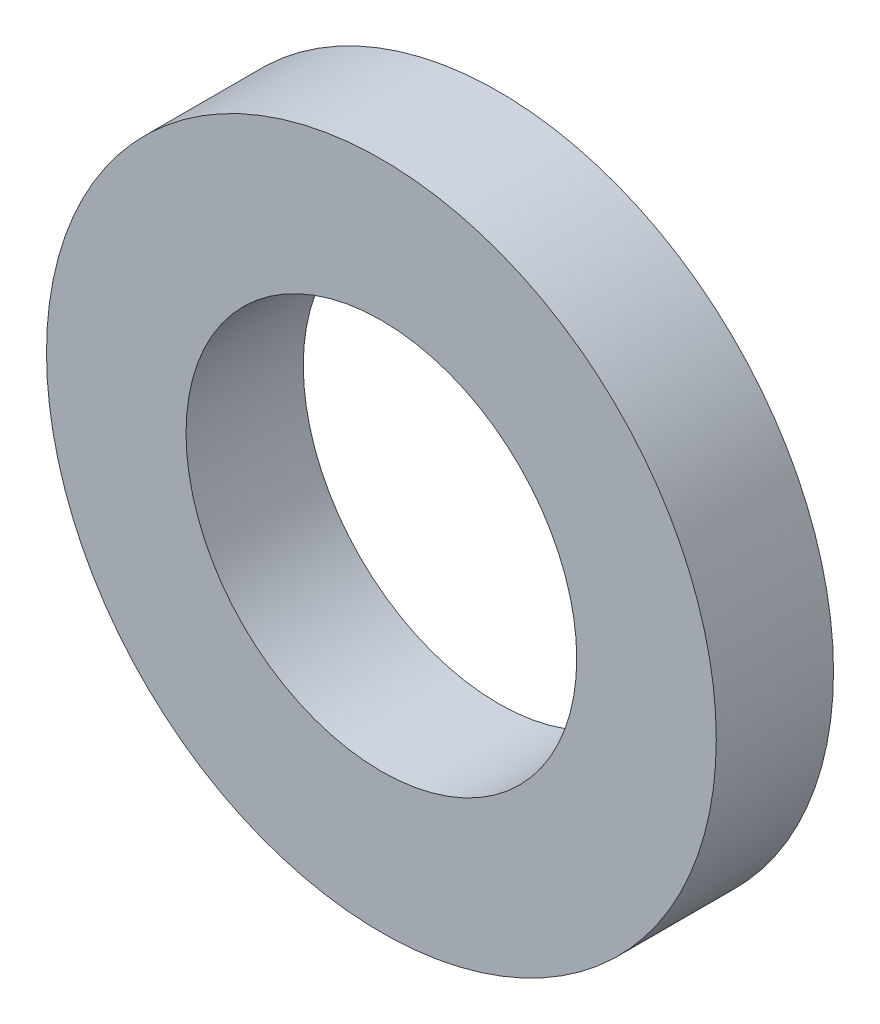
ISO-10303-21;
HEADER;
FILE_DESCRIPTION(('STEP AP214'),'2;1');
FILE_NAME('part.step','',(''),(''),'','','');
FILE_SCHEMA(('AUTOMOTIVE_DESIGN { 1 0 10303 214 1 1 1 1 }'));
ENDSEC;
DATA;
#1=APPLICATION_CONTEXT('core data for automotive mechanical design processes');
#2=APPLICATION_PROTOCOL_DEFINITION('international standard','automotive_design',2000,#1);
#3=PRODUCT_CONTEXT('',#1,'mechanical');
#4=PRODUCT('Part','Part','',(#3));
#5=PRODUCT_RELATED_PRODUCT_CATEGORY('part','',(#4));
#6=PRODUCT_DEFINITION_FORMATION('','',#4);
#7=PRODUCT_DEFINITION_CONTEXT('part definition',#1,'design');
#8=PRODUCT_DEFINITION('design','',#6,#7);
#9=PRODUCT_DEFINITION_SHAPE('','',#8);
#10=(LENGTH_UNIT() NAMED_UNIT(*) SI_UNIT(.MILLI.,.METRE.));
#11=(NAMED_UNIT(*) PLANE_ANGLE_UNIT() SI_UNIT($,.RADIAN.));
#12=(NAMED_UNIT(*) SI_UNIT($,.STERADIAN.) SOLID_ANGLE_UNIT());
#13=UNCERTAINTY_MEASURE_WITH_UNIT(LENGTH_MEASURE(1.E-05),#10,'distance_accuracy_value','');
#14=(GEOMETRIC_REPRESENTATION_CONTEXT(3) GLOBAL_UNCERTAINTY_ASSIGNED_CONTEXT((#13)) GLOBAL_UNIT_ASSIGNED_CONTEXT((#10,
#11,#12)) REPRESENTATION_CONTEXT('',''));
#15=CARTESIAN_POINT('',(0.,0.,0.));
#16=DIRECTION('',(0.,0.,1.));
#17=DIRECTION('',(1.,0.,0.));
#18=AXIS2_PLACEMENT_3D('',#15,#16,#17);
#19=CARTESIAN_POINT('',(0.,0.,2.1));
#20=DIRECTION('',(0.,0.,-1.));
#21=DIRECTION('',(0.,-1.,0.));
#22=AXIS2_PLACEMENT_3D('',#19,#20,#21);
#23=CYLINDRICAL_SURFACE('',#22,3.5);
#24=CARTESIAN_POINT('',(0.,0.,0.));
#25=DIRECTION('',(0.,0.,1.));
#26=DIRECTION('',(1.,0.,0.));
#27=AXIS2_PLACEMENT_3D('',#24,#25,#26);
#28=CIRCLE('',#27,3.5);
#29=CARTESIAN_POINT('',(3.5,0.,0.));
#30=VERTEX_POINT('',#29);
#31=EDGE_CURVE('E27',#30,#30,#28,.T.);
#32=ORIENTED_EDGE('',*,*,#31,.F.);
#33=EDGE_LOOP('',(#32));
#34=FACE_BOUND('',#33,.T.);
#35=CARTESIAN_POINT('',(0.,0.,2.1));
#36=DIRECTION('',(0.,0.,1.));
#37=DIRECTION('',(1.,0.,0.));
#38=AXIS2_PLACEMENT_3D('',#35,#36,#37);
#39=CIRCLE('',#38,3.5);
#40=CARTESIAN_POINT('',(3.5,0.,2.1));
#41=VERTEX_POINT('',#40);
#42=EDGE_CURVE('E10',#41,#41,#39,.T.);
#43=ORIENTED_EDGE('',*,*,#42,.T.);
#44=EDGE_LOOP('',(#43));
#45=FACE_BOUND('',#44,.T.);
#46=ADVANCED_FACE('F14',(#34,#45),#23,.F.);
#47=CARTESIAN_POINT('',(0.,0.,2.1));
#48=DIRECTION('',(0.,0.,-1.));
#49=DIRECTION('',(0.,-1.,0.));
#50=AXIS2_PLACEMENT_3D('',#47,#48,#49);
#51=CYLINDRICAL_SURFACE('',#50,6.);
#52=CARTESIAN_POINT('',(0.,0.,2.1));
#53=DIRECTION('',(0.,0.,1.));
#54=DIRECTION('',(1.,0.,0.));
#55=AXIS2_PLACEMENT_3D('',#52,#53,#54);
#56=CIRCLE('',#55,6.);
#57=CARTESIAN_POINT('',(6.,0.,2.1));
#58=VERTEX_POINT('',#57);
#59=EDGE_CURVE('E25',#58,#58,#56,.T.);
#60=ORIENTED_EDGE('',*,*,#59,.F.);
#61=EDGE_LOOP('',(#60));
#62=FACE_BOUND('',#61,.T.);
#63=CARTESIAN_POINT('',(0.,0.,0.));
#64=DIRECTION('',(0.,0.,1.));
#65=DIRECTION('',(1.,0.,0.));
#66=AXIS2_PLACEMENT_3D('',#63,#64,#65);
#67=CIRCLE('',#66,6.);
#68=CARTESIAN_POINT('',(6.,0.,0.));
#69=VERTEX_POINT('',#68);
#70=EDGE_CURVE('E17',#69,#69,#67,.T.);
#71=ORIENTED_EDGE('',*,*,#70,.T.);
#72=EDGE_LOOP('',(#71));
#73=FACE_BOUND('',#72,.T.);
#74=ADVANCED_FACE('F37',(#62,#73),#51,.T.);
#75=CARTESIAN_POINT('',(0.,0.,2.1));
#76=DIRECTION('',(0.,0.,1.));
#77=DIRECTION('',(1.,0.,0.));
#78=AXIS2_PLACEMENT_3D('',#75,#76,#77);
#79=PLANE('',#78);
#80=ORIENTED_EDGE('',*,*,#59,.T.);
#81=EDGE_LOOP('',(#80));
#82=FACE_BOUND('',#81,.T.);
#83=ORIENTED_EDGE('',*,*,#42,.F.);
#84=EDGE_LOOP('',(#83));
#85=FACE_BOUND('',#84,.T.);
#86=ADVANCED_FACE('F42',(#82,#85),#79,.T.);
#87=CARTESIAN_POINT('',(0.,0.,0.));
#88=DIRECTION('',(0.,0.,1.));
#89=DIRECTION('',(1.,0.,0.));
#90=AXIS2_PLACEMENT_3D('',#87,#88,#89);
#91=PLANE('',#90);
#92=ORIENTED_EDGE('',*,*,#70,.F.);
#93=EDGE_LOOP('',(#92));
#94=FACE_BOUND('',#93,.T.);
#95=ORIENTED_EDGE('',*,*,#31,.T.);
#96=EDGE_LOOP('',(#95));
#97=FACE_BOUND('',#96,.T.);
#98=ADVANCED_FACE('F34',(#94,#97),#91,.F.);
#99=CLOSED_SHELL('',(#46,#74,#86,#98));
#100=MANIFOLD_SOLID_BREP('B1',#99);
#101=ADVANCED_BREP_SHAPE_REPRESENTATION('',(#18,#100),#14);
#102=SHAPE_DEFINITION_REPRESENTATION(#9,#101);
ENDSEC;
END-ISO-10303-21;
